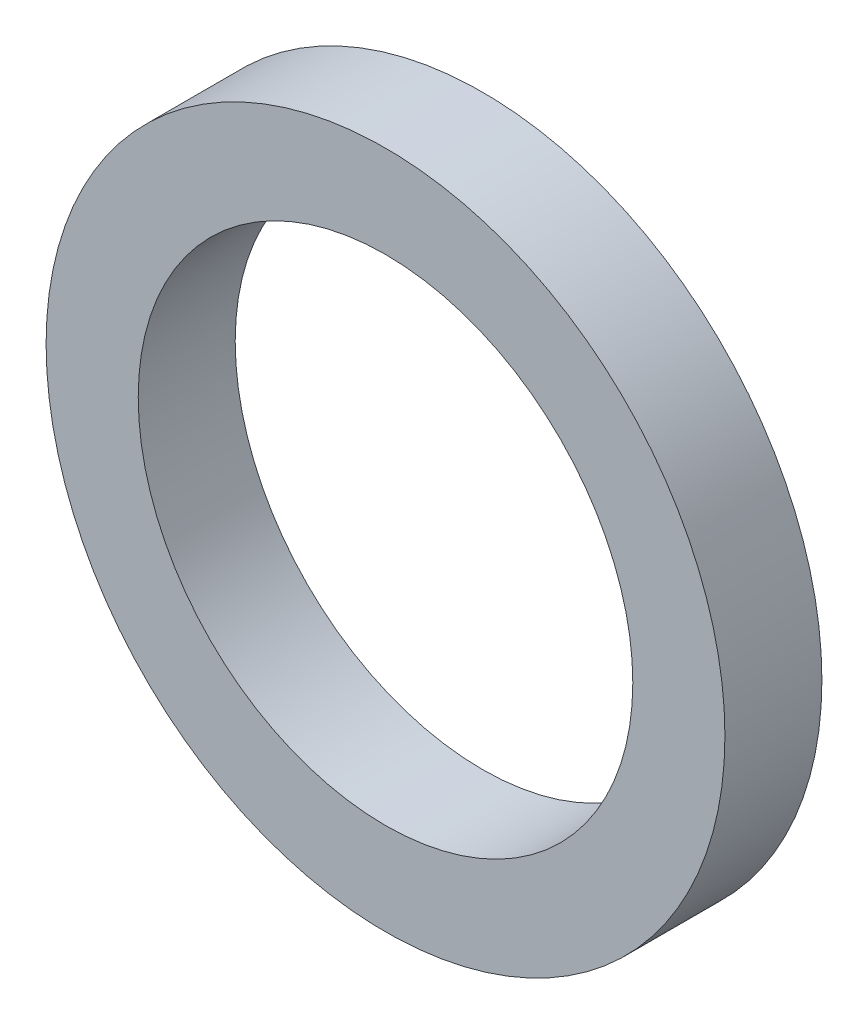
ISO-10303-21;
HEADER;
FILE_DESCRIPTION(('STEP AP214'),'2;1');
FILE_NAME('part.step','',(''),(''),'','','');
FILE_SCHEMA(('AUTOMOTIVE_DESIGN { 1 0 10303 214 1 1 1 1 }'));
ENDSEC;
DATA;
#1=APPLICATION_CONTEXT('core data for automotive mechanical design processes');
#2=APPLICATION_PROTOCOL_DEFINITION('international standard','automotive_design',2000,#1);
#3=PRODUCT_CONTEXT('',#1,'mechanical');
#4=PRODUCT('Part','Part','',(#3));
#5=PRODUCT_RELATED_PRODUCT_CATEGORY('part','',(#4));
#6=PRODUCT_DEFINITION_FORMATION('','',#4);
#7=PRODUCT_DEFINITION_CONTEXT('part definition',#1,'design');
#8=PRODUCT_DEFINITION('design','',#6,#7);
#9=PRODUCT_DEFINITION_SHAPE('','',#8);
#10=(LENGTH_UNIT() NAMED_UNIT(*) SI_UNIT(.MILLI.,.METRE.));
#11=(NAMED_UNIT(*) PLANE_ANGLE_UNIT() SI_UNIT($,.RADIAN.));
#12=(NAMED_UNIT(*) SI_UNIT($,.STERADIAN.) SOLID_ANGLE_UNIT());
#13=UNCERTAINTY_MEASURE_WITH_UNIT(LENGTH_MEASURE(1.E-05),#10,'distance_accuracy_value','');
#14=(GEOMETRIC_REPRESENTATION_CONTEXT(3) GLOBAL_UNCERTAINTY_ASSIGNED_CONTEXT((#13)) GLOBAL_UNIT_ASSIGNED_CONTEXT((#10,
#11,#12)) REPRESENTATION_CONTEXT('',''));
#15=CARTESIAN_POINT('',(0.,0.,0.));
#16=DIRECTION('',(0.,0.,1.));
#17=DIRECTION('',(1.,0.,0.));
#18=AXIS2_PLACEMENT_3D('',#15,#16,#17);
#19=CARTESIAN_POINT('',(0.,0.,0.5));
#20=DIRECTION('',(0.,0.,1.));
#21=DIRECTION('',(1.,0.,0.));
#22=AXIS2_PLACEMENT_3D('',#19,#20,#21);
#23=PLANE('',#22);
#24=CARTESIAN_POINT('',(0.,0.,0.5));
#25=DIRECTION('',(0.,0.,1.));
#26=DIRECTION('',(1.,0.,0.));
#27=AXIS2_PLACEMENT_3D('',#24,#25,#26);
#28=CIRCLE('',#27,3.5);
#29=CARTESIAN_POINT('',(3.5,0.,0.5));
#30=VERTEX_POINT('',#29);
#31=EDGE_CURVE('E10',#30,#30,#28,.T.);
#32=ORIENTED_EDGE('',*,*,#31,.T.);
#33=EDGE_LOOP('',(#32));
#34=FACE_BOUND('',#33,.T.);
#35=CARTESIAN_POINT('',(0.,0.,0.5));
#36=DIRECTION('',(0.,0.,1.));
#37=DIRECTION('',(1.,0.,0.));
#38=AXIS2_PLACEMENT_3D('',#35,#36,#37);
#39=CIRCLE('',#38,2.55);
#40=CARTESIAN_POINT('',(2.55,0.,0.5));
#41=VERTEX_POINT('',#40);
#42=EDGE_CURVE('E44',#41,#41,#39,.T.);
#43=ORIENTED_EDGE('',*,*,#42,.F.);
#44=EDGE_LOOP('',(#43));
#45=FACE_BOUND('',#44,.T.);
#46=ADVANCED_FACE('F33',(#34,#45),#23,.T.);
#47=CARTESIAN_POINT('',(0.,0.,-0.5));
#48=DIRECTION('',(0.,0.,1.));
#49=DIRECTION('',(1.,0.,0.));
#50=AXIS2_PLACEMENT_3D('',#47,#48,#49);
#51=PLANE('',#50);
#52=CARTESIAN_POINT('',(0.,0.,-0.5));
#53=DIRECTION('',(0.,0.,1.));
#54=DIRECTION('',(1.,0.,0.));
#55=AXIS2_PLACEMENT_3D('',#52,#53,#54);
#56=CIRCLE('',#55,3.5);
#57=CARTESIAN_POINT('',(3.5,0.,-0.5));
#58=VERTEX_POINT('',#57);
#59=EDGE_CURVE('E37',#58,#58,#56,.T.);
#60=ORIENTED_EDGE('',*,*,#59,.F.);
#61=EDGE_LOOP('',(#60));
#62=FACE_BOUND('',#61,.T.);
#63=CARTESIAN_POINT('',(0.,0.,-0.5));
#64=DIRECTION('',(0.,0.,1.));
#65=DIRECTION('',(1.,0.,0.));
#66=AXIS2_PLACEMENT_3D('',#63,#64,#65);
#67=CIRCLE('',#66,2.55);
#68=CARTESIAN_POINT('',(2.55,0.,-0.5));
#69=VERTEX_POINT('',#68);
#70=EDGE_CURVE('E46',#69,#69,#67,.T.);
#71=ORIENTED_EDGE('',*,*,#70,.T.);
#72=EDGE_LOOP('',(#71));
#73=FACE_BOUND('',#72,.T.);
#74=ADVANCED_FACE('F56',(#62,#73),#51,.F.);
#75=CARTESIAN_POINT('',(0.,0.,0.5));
#76=DIRECTION('',(0.,0.,-1.));
#77=DIRECTION('',(-1.,0.,0.));
#78=AXIS2_PLACEMENT_3D('',#75,#76,#77);
#79=CYLINDRICAL_SURFACE('',#78,3.5);
#80=ORIENTED_EDGE('',*,*,#31,.F.);
#81=EDGE_LOOP('',(#80));
#82=FACE_BOUND('',#81,.T.);
#83=ORIENTED_EDGE('',*,*,#59,.T.);
#84=EDGE_LOOP('',(#83));
#85=FACE_BOUND('',#84,.T.);
#86=ADVANCED_FACE('F35',(#82,#85),#79,.T.);
#87=CARTESIAN_POINT('',(0.,0.,0.5));
#88=DIRECTION('',(0.,0.,-1.));
#89=DIRECTION('',(-1.,0.,0.));
#90=AXIS2_PLACEMENT_3D('',#87,#88,#89);
#91=CYLINDRICAL_SURFACE('',#90,2.55);
#92=ORIENTED_EDGE('',*,*,#42,.T.);
#93=EDGE_LOOP('',(#92));
#94=FACE_BOUND('',#93,.T.);
#95=ORIENTED_EDGE('',*,*,#70,.F.);
#96=EDGE_LOOP('',(#95));
#97=FACE_BOUND('',#96,.T.);
#98=ADVANCED_FACE('F52',(#94,#97),#91,.F.);
#99=CLOSED_SHELL('',(#46,#74,#86,#98));
#100=MANIFOLD_SOLID_BREP('B2',#99);
#101=ADVANCED_BREP_SHAPE_REPRESENTATION('',(#18,#100),#14);
#102=SHAPE_DEFINITION_REPRESENTATION(#9,#101);
ENDSEC;
END-ISO-10303-21;
